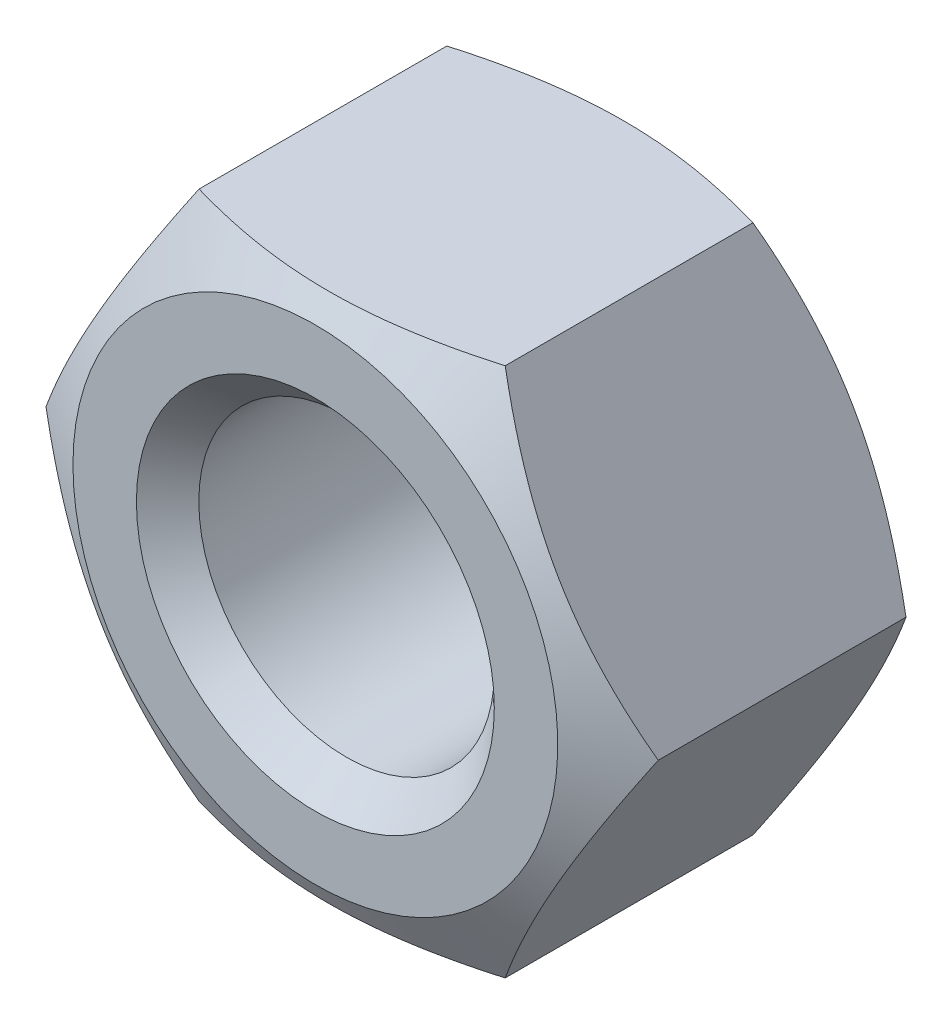
ISO-10303-21;
HEADER;
FILE_DESCRIPTION(('STEP AP214'),'2;1');
FILE_NAME('part.step','',(''),(''),'','','');
FILE_SCHEMA(('AUTOMOTIVE_DESIGN { 1 0 10303 214 1 1 1 1 }'));
ENDSEC;
DATA;
#1=APPLICATION_CONTEXT('core data for automotive mechanical design processes');
#2=APPLICATION_PROTOCOL_DEFINITION('international standard','automotive_design',2000,#1);
#3=PRODUCT_CONTEXT('',#1,'mechanical');
#4=PRODUCT('Part','Part','',(#3));
#5=PRODUCT_RELATED_PRODUCT_CATEGORY('part','',(#4));
#6=PRODUCT_DEFINITION_FORMATION('','',#4);
#7=PRODUCT_DEFINITION_CONTEXT('part definition',#1,'design');
#8=PRODUCT_DEFINITION('design','',#6,#7);
#9=PRODUCT_DEFINITION_SHAPE('','',#8);
#10=(LENGTH_UNIT() NAMED_UNIT(*) SI_UNIT(.MILLI.,.METRE.));
#11=(NAMED_UNIT(*) PLANE_ANGLE_UNIT() SI_UNIT($,.RADIAN.));
#12=(NAMED_UNIT(*) SI_UNIT($,.STERADIAN.) SOLID_ANGLE_UNIT());
#13=UNCERTAINTY_MEASURE_WITH_UNIT(LENGTH_MEASURE(1.E-05),#10,'distance_accuracy_value','');
#14=(GEOMETRIC_REPRESENTATION_CONTEXT(3) GLOBAL_UNCERTAINTY_ASSIGNED_CONTEXT((#13)) GLOBAL_UNIT_ASSIGNED_CONTEXT((#10,
#11,#12)) REPRESENTATION_CONTEXT('',''));
#15=CARTESIAN_POINT('',(0.,0.,0.));
#16=DIRECTION('',(0.,0.,1.));
#17=DIRECTION('',(1.,0.,0.));
#18=AXIS2_PLACEMENT_3D('',#15,#16,#17);
#19=CARTESIAN_POINT('',(-4.61880215351701,-8.,-9.3));
#20=DIRECTION('',(0.,-1.,0.));
#21=DIRECTION('',(0.,0.,-1.));
#22=AXIS2_PLACEMENT_3D('',#19,#20,#21);
#23=PLANE('',#22);
#24=DIRECTION('',(0.,0.,1.));
#25=VECTOR('',#24,1.);
#26=CARTESIAN_POINT('',(4.61880215351701,-8.,-9.3));
#27=LINE('',#26,#25);
#28=CARTESIAN_POINT('',(4.618802153517,-8.,-8.58546882018368));
#29=VERTEX_POINT('',#28);
#30=CARTESIAN_POINT('',(4.61880215351701,-8.,-1.11001611421122));
#31=VERTEX_POINT('',#30);
#32=EDGE_CURVE('E142',#29,#31,#27,.T.);
#33=ORIENTED_EDGE('',*,*,#32,.T.);
#34=CARTESIAN_POINT('',(-12.1949748492486,-8.,-4.19724118622931));
#35=CARTESIAN_POINT('',(-11.8441525038451,-8.,-4.02793268891842));
#36=CARTESIAN_POINT('',(-11.4924944780281,-8.,-3.86032413028313));
#37=CARTESIAN_POINT('',(-10.7870549229949,-8.,-3.52947959624148));
#38=CARTESIAN_POINT('',(-10.4332730330776,-8.,-3.36624439085434));
#39=CARTESIAN_POINT('',(-9.72119527642904,-8.,-3.04424732546881));
#40=CARTESIAN_POINT('',(-9.36288512784639,-8.,-2.88551693342629));
#41=CARTESIAN_POINT('',(-8.6432995701573,-8.,-2.574953375877));
#42=CARTESIAN_POINT('',(-8.28202431872118,-8.,-2.42311984639713));
#43=CARTESIAN_POINT('',(-7.55170487318987,-8.,-2.12648838512486));
#44=CARTESIAN_POINT('',(-7.18261915131932,-8.,-1.98179212335422));
#45=CARTESIAN_POINT('',(-6.44007589079319,-8.,-1.70386945908389));
#46=CARTESIAN_POINT('',(-6.0666178689625,-8.,-1.57064433809319));
#47=CARTESIAN_POINT('',(-5.31551676447197,-8.,-1.31928431629794));
#48=CARTESIAN_POINT('',(-4.9378847017788,-8.,-1.20111684863991));
#49=CARTESIAN_POINT('',(-4.17726851344058,-8.,-0.983743090850943));
#50=CARTESIAN_POINT('',(-3.79428613643383,-8.,-0.884530754330406));
#51=CARTESIAN_POINT('',(-3.02262181211731,-8.,-0.709920973952184));
#52=CARTESIAN_POINT('',(-2.63393771225764,-8.,-0.634532779779429));
#53=CARTESIAN_POINT('',(-2.04753859900277,-8.,-0.543124585972716));
#54=CARTESIAN_POINT('',(-1.8514859408059,-8.,-0.516265583396867));
#55=CARTESIAN_POINT('',(-1.45847995672493,-8.,-0.470301524605603));
#56=CARTESIAN_POINT('',(-1.26152671768549,-8.,-0.451195736041205));
#57=CARTESIAN_POINT('',(-0.868204305547407,-8.,-0.421249766233311));
#58=CARTESIAN_POINT('',(-0.671838949148873,-8.,-0.410359651726772));
#59=CARTESIAN_POINT('',(-0.278823944329975,-8.,-0.39690166509556));
#60=CARTESIAN_POINT('',(-0.0821743001878422,-8.,-0.394333669009646));
#61=CARTESIAN_POINT('',(0.311002357947693,-8.,-0.397580881899422));
#62=CARTESIAN_POINT('',(0.50752939079069,-8.,-0.403393786882911));
#63=CARTESIAN_POINT('',(0.900169309914778,-8.,-0.423259858206472));
#64=CARTESIAN_POINT('',(1.09628217308338,-8.,-0.437313472824583));
#65=CARTESIAN_POINT('',(1.57322634258838,-8.,-0.481221762837537));
#66=CARTESIAN_POINT('',(1.85367662645004,-8.,-0.515295721906791));
#67=CARTESIAN_POINT('',(2.41234314578804,-8.,-0.598385815642348));
#68=CARTESIAN_POINT('',(2.690559036092,-8.,-0.647404215050205));
#69=CARTESIAN_POINT('',(3.52235877714175,-8.,-0.814413300270185));
#70=CARTESIAN_POINT('',(4.07200316956031,-8.,-0.952244696212976));
#71=CARTESIAN_POINT('',(4.89407143348197,-8.,-1.18944101491719));
#72=CARTESIAN_POINT('',(5.17080192256967,-8.,-1.27472329993464));
#73=CARTESIAN_POINT('',(5.72158954521634,-8.,-1.45367681640488));
#74=CARTESIAN_POINT('',(5.99564643756773,-8.,-1.54734879714129));
#75=CARTESIAN_POINT('',(6.53971765413399,-8.,-1.7410831972039));
#76=CARTESIAN_POINT('',(6.80974608565716,-8.,-1.8411063985716));
#77=CARTESIAN_POINT('',(7.34751308876101,-8.,-2.04687153439181));
#78=CARTESIAN_POINT('',(7.61525241587318,-8.,-2.15261149038612));
#79=CARTESIAN_POINT('',(7.8820292455801,-8.,-2.2606729368487));
#80=B_SPLINE_CURVE_WITH_KNOTS('',3,(#34,#35,#36,#37,#38,#39,#40,#41,#42,#43,#44,#45,#46,#47,#48,
#49,#50,#51,#52,#53,#54,#55,#56,#57,#58,#59,#60,#61,#62,#63,#64,#65,#66,#67,#68,#69,#70,#71,#72,
#73,#74,#75,#76,#77,#78,#79),.UNSPECIFIED.,.F.,.F.,(4,2,2,2,2,2,2,2,2,2,2,2,2,2,2,2,2,2,2,2,2,2,
4),(0.,1.16863703281298,2.33747849380213,3.51310498437554,4.68866936050934,5.87782866135943,
7.0671206383311,8.25379509233117,9.44009038147788,10.62684568362,11.2203681854234,
11.8138346115359,12.4036643426842,12.9934852880453,13.5831441167368,14.1728350246593,
15.0198905398413,15.8670744851381,17.5647199147032,18.433374582602,19.3021069075453,
20.165916700221,21.0294294352115),.UNSPECIFIED.);
#81=CARTESIAN_POINT('',(-4.618802153517,-8.00000000000001,-1.11001611421122));
#82=VERTEX_POINT('',#81);
#83=EDGE_CURVE('E50',#31,#82,#80,.F.);
#84=ORIENTED_EDGE('',*,*,#83,.T.);
#85=DIRECTION('',(0.,0.,1.));
#86=VECTOR('',#85,1.);
#87=CARTESIAN_POINT('',(-4.61880215351701,-8.,-9.3));
#88=LINE('',#87,#86);
#89=CARTESIAN_POINT('',(-4.618802153517,-8.,-8.58546882018368));
#90=VERTEX_POINT('',#89);
#91=EDGE_CURVE('E123',#90,#82,#88,.T.);
#92=ORIENTED_EDGE('',*,*,#91,.F.);
#93=CARTESIAN_POINT('',(-12.2497439799177,-8.,-5.47178635751885));
#94=CARTESIAN_POINT('',(-11.8984987351192,-8.,-5.64152745781741));
#95=CARTESIAN_POINT('',(-11.5464230390782,-8.,-5.80958119206085));
#96=CARTESIAN_POINT('',(-10.8401616983867,-8.,-6.14134970673033));
#97=CARTESIAN_POINT('',(-10.4859757012545,-8.,-6.30506373591479));
#98=CARTESIAN_POINT('',(-9.77313142803809,-8.,-6.62805107323012));
#99=CARTESIAN_POINT('',(-9.41445915782843,-8.,-6.78729360758338));
#100=CARTESIAN_POINT('',(-8.69416671490282,-8.,-7.09893883145));
#101=CARTESIAN_POINT('',(-8.33254669701134,-8.,-7.25134187749306));
#102=CARTESIAN_POINT('',(-7.60129405984853,-8.,-7.54929869059785));
#103=CARTESIAN_POINT('',(-7.23161757485956,-8.,-7.69474539925));
#104=CARTESIAN_POINT('',(-6.48790521752625,-8.,-7.97424757040319));
#105=CARTESIAN_POINT('',(-6.11386886541891,-8.,-8.1083017655467));
#106=CARTESIAN_POINT('',(-5.36160531585211,-8.,-8.36141638272023));
#107=CARTESIAN_POINT('',(-4.98338896232049,-8.,-8.48050868146435));
#108=CARTESIAN_POINT('',(-4.22159300341406,-8.,-8.69983373573668));
#109=CARTESIAN_POINT('',(-3.83801513546604,-8.,-8.80007245532316));
#110=CARTESIAN_POINT('',(-3.06517005833207,-8.,-8.97681673496987));
#111=CARTESIAN_POINT('',(-2.67590136311895,-8.,-9.05331597577213));
#112=CARTESIAN_POINT('',(-2.0885729036225,-8.,-9.14642984148509));
#113=CARTESIAN_POINT('',(-1.89220175174277,-8.,-9.17386398482566));
#114=CARTESIAN_POINT('',(-1.49853877384914,-8.,-9.22098081548842));
#115=CARTESIAN_POINT('',(-1.30124704094028,-8.,-9.24066427020763));
#116=CARTESIAN_POINT('',(-0.907261125171467,-8.,-9.27175001536059));
#117=CARTESIAN_POINT('',(-0.710571016085377,-8.,-9.28320372918925));
#118=CARTESIAN_POINT('',(-0.316882268583067,-8.,-9.29776943665632));
#119=CARTESIAN_POINT('',(-0.11988363420673,-8.,-9.30088153862247));
#120=CARTESIAN_POINT('',(0.274012171056988,-8.,-9.29868986812036));
#121=CARTESIAN_POINT('',(0.470909354903373,-8.,-9.29338845754377));
#122=CARTESIAN_POINT('',(0.864308658379612,-8.,-9.27450159390205));
#123=CARTESIAN_POINT('',(1.06081075778877,-8.,-9.26091572714249));
#124=CARTESIAN_POINT('',(1.53707134445824,-8.,-9.21823147688152));
#125=CARTESIAN_POINT('',(1.81646391313848,-8.,-9.18498228456822));
#126=CARTESIAN_POINT('',(2.37310809107458,-8.,-9.10358169500833));
#127=CARTESIAN_POINT('',(2.6503590947618,-8.,-9.05542623022555));
#128=CARTESIAN_POINT('',(3.20249141370953,-8.,-8.94592101606853));
#129=CARTESIAN_POINT('',(3.47737023104613,-8.,-8.88455879141516));
#130=CARTESIAN_POINT('',(4.02429975324255,-8.,-8.75051229166833));
#131=CARTESIAN_POINT('',(4.29635072195133,-8.,-8.67782908316642));
#132=CARTESIAN_POINT('',(4.84432510211618,-8.,-8.52097954855783));
#133=CARTESIAN_POINT('',(5.12017997476417,-8.,-8.43657541783993));
#134=CARTESIAN_POINT('',(5.66897392708338,-8.,-8.25942754035761));
#135=CARTESIAN_POINT('',(5.94191487461255,-8.,-8.16668954576064));
#136=CARTESIAN_POINT('',(6.48378576423065,-8.,-7.97478953482265));
#137=CARTESIAN_POINT('',(6.75272963565239,-8.,-7.87566661531194));
#138=CARTESIAN_POINT('',(7.28853074702756,-8.,-7.67160282538498));
#139=CARTESIAN_POINT('',(7.55538709319948,-8.,-7.56665960355147));
#140=CARTESIAN_POINT('',(7.82127397973363,-8.,-7.45938198691646));
#141=B_SPLINE_CURVE_WITH_KNOTS('',3,(#93,#94,#95,#96,#97,#98,#99,#100,#101,#102,#103,#104,#105,
#106,#107,#108,#109,#110,#111,#112,#113,#114,#115,#116,#117,#118,#119,#120,#121,#122,#123,#124,
#125,#126,#127,#128,#129,#130,#131,#132,#133,#134,#135,#136,#137,#138,#139,#140),.UNSPECIFIED.,
.F.,.F.,(4,2,2,2,2,2,2,2,2,2,2,2,2,2,2,2,2,2,2,2,2,2,2,4),(0.,1.17034358506454,2.3408884611985,
3.51813189291972,4.69531388569646,5.88694801994962,7.07871454421366,8.26789729395168,
9.45670322782925,10.6458253413567,11.2405311012284,11.8351779643656,12.4260760875167,
13.0169665369751,13.6076911374643,14.1984452389235,15.0420672118768,15.8859195906795,
16.7305726096943,17.5751460989191,18.4404219096463,19.305105014024,20.1649211009825,
21.0250871227257),.UNSPECIFIED.);
#142=CARTESIAN_POINT('',(0.,-8.,-9.3));
#143=VERTEX_POINT('',#142);
#144=EDGE_CURVE('E227',#90,#143,#141,.T.);
#145=ORIENTED_EDGE('',*,*,#144,.T.);
#146=EDGE_CURVE('E222',#143,#29,#141,.T.);
#147=ORIENTED_EDGE('',*,*,#146,.T.);
#148=EDGE_LOOP('',(#33,#84,#92,#145,#147));
#149=FACE_BOUND('',#148,.T.);
#150=ADVANCED_FACE('F35',(#149),#23,.T.);
#151=CARTESIAN_POINT('',(-9.23760430703401,0.,-9.3));
#152=DIRECTION('',(-0.866025403784439,-0.5,0.));
#153=DIRECTION('',(0.5,-0.866025403784439,0.));
#154=AXIS2_PLACEMENT_3D('',#151,#152,#153);
#155=PLANE('',#154);
#156=ORIENTED_EDGE('',*,*,#91,.T.);
#157=CARTESIAN_POINT('',(-4.61868668346317,-8.0002,-1.11008278212786));
#158=CARTESIAN_POINT('',(-4.72021302617289,-7.8243512161201,-1.05147564844219));
#159=CARTESIAN_POINT('',(-4.82211789504564,-7.64784680569386,-0.99552833544218));
#160=CARTESIAN_POINT('',(-5.02675523421805,-7.29340453712154,-0.889685939419556));
#161=CARTESIAN_POINT('',(-5.12948804149869,-7.11546609530729,-0.839793468825956));
#162=CARTESIAN_POINT('',(-5.43933133858026,-6.57880176237735,-0.700177731601756));
#163=CARTESIAN_POINT('',(-5.64766491807818,-6.21795741776427,-0.620766105373259));
#164=CARTESIAN_POINT('',(-5.95943209350317,-5.67796082979595,-0.527646580689379));
#165=CARTESIAN_POINT('',(-6.06193429416807,-5.50042181035671,-0.501119515424015));
#166=CARTESIAN_POINT('',(-6.26740224104455,-5.1445408870398,-0.456638109253766));
#167=CARTESIAN_POINT('',(-6.37036794548792,-4.96619905550676,-0.438683010909471));
#168=CARTESIAN_POINT('',(-6.57647664551585,-4.6092083151764,-0.411800582886755));
#169=CARTESIAN_POINT('',(-6.67961930623067,-4.4305599863905,-0.402863007941123));
#170=CARTESIAN_POINT('',(-6.88599991003618,-4.07309829490261,-0.39420723836002));
#171=CARTESIAN_POINT('',(-6.98923785008464,-3.89428493746993,-0.39448875889774));
#172=CARTESIAN_POINT('',(-7.18224506616975,-3.55998663298309,-0.403629959663666));
#173=CARTESIAN_POINT('',(-7.27202796205376,-3.40447809566133,-0.41137453876226));
#174=CARTESIAN_POINT('',(-7.45138347289924,-3.09382523825949,-0.433686069248319));
#175=CARTESIAN_POINT('',(-7.5409560732765,-2.93868094344,-0.448253480533037));
#176=CARTESIAN_POINT('',(-7.80932710333148,-2.47384868410518,-0.501845624922425));
#177=CARTESIAN_POINT('',(-7.98765049311728,-2.16498351281828,-0.550753576064033));
#178=CARTESIAN_POINT('',(-8.34618890253624,-1.5439767712397,-0.673024337629203));
#179=CARTESIAN_POINT('',(-8.52635816315521,-1.23191445788552,-0.746905454770888));
#180=CARTESIAN_POINT('',(-8.88400987687704,-0.612443518305239,-0.914585075649859));
#181=CARTESIAN_POINT('',(-9.06149691008277,-0.305026959108247,-1.00834419524934));
#182=CARTESIAN_POINT('',(-9.23771977708785,0.000200000000002295,-1.11008278212786));
#183=B_SPLINE_CURVE_WITH_KNOTS('',3,(#157,#158,#159,#160,#161,#162,#163,#164,#165,#166,#167,
#168,#169,#170,#171,#172,#173,#174,#175,#176,#177,#178,#179,#180,#181,#182),.UNSPECIFIED.,.F.,
.F.,(4,2,2,2,2,2,2,2,2,2,2,2,4),(0.,0.633973543721349,1.26821965714356,2.53934712434766,
3.15934343977049,3.77928496069784,4.39852133866766,5.01773858515595,5.55680239410248,
6.09590254421147,7.17487077411835,8.27776850154292,9.37850115249054),.UNSPECIFIED.);
#184=CARTESIAN_POINT('',(-9.23760430703402,0.,-1.11001611421122));
#185=VERTEX_POINT('',#184);
#186=EDGE_CURVE('E107',#82,#185,#183,.T.);
#187=ORIENTED_EDGE('',*,*,#186,.T.);
#188=DIRECTION('',(0.,0.,1.));
#189=VECTOR('',#188,1.);
#190=CARTESIAN_POINT('',(-9.23760430703401,0.,-9.3));
#191=LINE('',#190,#189);
#192=CARTESIAN_POINT('',(-9.23760430703401,0.,-8.58546882018368));
#193=VERTEX_POINT('',#192);
#194=EDGE_CURVE('E120',#193,#185,#191,.T.);
#195=ORIENTED_EDGE('',*,*,#194,.F.);
#196=CARTESIAN_POINT('',(-9.23771977708785,0.000200000000001784,-8.58540215226703));
#197=CARTESIAN_POINT('',(-9.13619343437813,-0.175648783879895,-8.64400928595271));
#198=CARTESIAN_POINT('',(-9.03428856550538,-0.352153194306133,-8.69995659895271));
#199=CARTESIAN_POINT('',(-8.82965122633297,-0.706595462878457,-8.80579899497534));
#200=CARTESIAN_POINT('',(-8.72691841905232,-0.884533904692709,-8.85569146556894));
#201=CARTESIAN_POINT('',(-8.41707512197076,-1.42119823762264,-8.99530720279314));
#202=CARTESIAN_POINT('',(-8.20874154247284,-1.78204258223572,-9.07471882902163));
#203=CARTESIAN_POINT('',(-7.89697436704785,-2.32203917020405,-9.16783835370551));
#204=CARTESIAN_POINT('',(-7.79447216638295,-2.49957818964328,-9.19436541897088));
#205=CARTESIAN_POINT('',(-7.58900421950647,-2.8554591129602,-9.23884682514113));
#206=CARTESIAN_POINT('',(-7.4860385150631,-3.03380094449324,-9.25680192348542));
#207=CARTESIAN_POINT('',(-7.27992981503517,-3.39079168482359,-9.28368435150814));
#208=CARTESIAN_POINT('',(-7.17678715432035,-3.5694400136095,-9.29262192645377));
#209=CARTESIAN_POINT('',(-6.97040655051484,-3.92690170509738,-9.30127769603487));
#210=CARTESIAN_POINT('',(-6.86716861046638,-4.10571506253006,-9.30099617549715));
#211=CARTESIAN_POINT('',(-6.67416139438127,-4.4400133670169,-9.29185497473123));
#212=CARTESIAN_POINT('',(-6.58437849849726,-4.59552190433867,-9.28411039563264));
#213=CARTESIAN_POINT('',(-6.40502298765178,-4.90617476174051,-9.26179886514658));
#214=CARTESIAN_POINT('',(-6.31545038727451,-5.06131905656,-9.24723145386186));
#215=CARTESIAN_POINT('',(-6.04707935721954,-5.52615131589481,-9.19363930947247));
#216=CARTESIAN_POINT('',(-5.86875596743374,-5.83501648718172,-9.14473135833086));
#217=CARTESIAN_POINT('',(-5.51021755801478,-6.4560232287603,-9.02246059676569));
#218=CARTESIAN_POINT('',(-5.3300482973958,-6.76808554211447,-8.94857947962401));
#219=CARTESIAN_POINT('',(-4.97239658367398,-7.38755648169476,-8.78089985874504));
#220=CARTESIAN_POINT('',(-4.79490955046825,-7.69497304089175,-8.68714073914555));
#221=CARTESIAN_POINT('',(-4.61868668346317,-8.0002,-8.58540215226703));
#222=B_SPLINE_CURVE_WITH_KNOTS('',3,(#196,#197,#198,#199,#200,#201,#202,#203,#204,#205,#206,
#207,#208,#209,#210,#211,#212,#213,#214,#215,#216,#217,#218,#219,#220,#221),.UNSPECIFIED.,.F.,
.F.,(4,2,2,2,2,2,2,2,2,2,2,2,4),(0.,0.633973543721349,1.26821965714356,2.53934712434766,
3.15934343977049,3.77928496069784,4.39852133866765,5.01773858515595,5.55680239410248,
6.09590254421147,7.17487077411834,8.27776850154292,9.37850115249054),.UNSPECIFIED.);
#223=CARTESIAN_POINT('',(-6.92820323027551,-4.,-9.3));
#224=VERTEX_POINT('',#223);
#225=EDGE_CURVE('E167',#193,#224,#222,.T.);
#226=ORIENTED_EDGE('',*,*,#225,.T.);
#227=EDGE_CURVE('E168',#224,#90,#222,.T.);
#228=ORIENTED_EDGE('',*,*,#227,.T.);
#229=EDGE_LOOP('',(#156,#187,#195,#226,#228));
#230=FACE_BOUND('',#229,.T.);
#231=ADVANCED_FACE('F118',(#230),#155,.T.);
#232=CARTESIAN_POINT('',(-4.61880215351701,8.,-9.3));
#233=DIRECTION('',(-0.866025403784439,0.5,0.));
#234=DIRECTION('',(-0.5,-0.866025403784439,0.));
#235=AXIS2_PLACEMENT_3D('',#232,#233,#234);
#236=PLANE('',#235);
#237=ORIENTED_EDGE('',*,*,#194,.T.);
#238=CARTESIAN_POINT('',(-9.23771977708785,-0.000199999999998216,-1.11008278212786));
#239=CARTESIAN_POINT('',(-9.13619343437812,0.175648783879898,-1.05147564844219));
#240=CARTESIAN_POINT('',(-9.03428856550538,0.352153194306137,-0.995528335442182));
#241=CARTESIAN_POINT('',(-8.82965122633296,0.706595462878461,-0.889685939419558));
#242=CARTESIAN_POINT('',(-8.72691841905232,0.884533904692714,-0.839793468825958));
#243=CARTESIAN_POINT('',(-8.41707512197076,1.42119823762265,-0.700177731601756));
#244=CARTESIAN_POINT('',(-8.20874154247284,1.78204258223572,-0.620766105373259));
#245=CARTESIAN_POINT('',(-7.89697436704785,2.32203917020405,-0.52764658068938));
#246=CARTESIAN_POINT('',(-7.79447216638294,2.49957818964329,-0.501119515424016));
#247=CARTESIAN_POINT('',(-7.58900421950647,2.8554591129602,-0.456638109253767));
#248=CARTESIAN_POINT('',(-7.4860385150631,3.03380094449324,-0.438683010909471));
#249=CARTESIAN_POINT('',(-7.27992981503517,3.3907916848236,-0.411800582886757));
#250=CARTESIAN_POINT('',(-7.17678715432035,3.5694400136095,-0.402863007941125));
#251=CARTESIAN_POINT('',(-6.97040655051484,3.92690170509739,-0.394207238360022));
#252=CARTESIAN_POINT('',(-6.86716861046638,4.10571506253007,-0.394488758897741));
#253=CARTESIAN_POINT('',(-6.67416139438127,4.44001336701691,-0.403629959663667));
#254=CARTESIAN_POINT('',(-6.58437849849726,4.59552190433867,-0.411374538762261));
#255=CARTESIAN_POINT('',(-6.40502298765178,4.90617476174051,-0.43368606924832));
#256=CARTESIAN_POINT('',(-6.31545038727451,5.06131905656,-0.448253480533039));
#257=CARTESIAN_POINT('',(-6.04707935721953,5.52615131589482,-0.501845624922427));
#258=CARTESIAN_POINT('',(-5.86875596743374,5.83501648718172,-0.550753576064035));
#259=CARTESIAN_POINT('',(-5.51021755801478,6.4560232287603,-0.673024337629205));
#260=CARTESIAN_POINT('',(-5.3300482973958,6.76808554211448,-0.746905454770891));
#261=CARTESIAN_POINT('',(-4.97239658367398,7.38755648169476,-0.914585075649863));
#262=CARTESIAN_POINT('',(-4.79490955046825,7.69497304089176,-1.00834419524935));
#263=CARTESIAN_POINT('',(-4.61868668346317,8.00020000000001,-1.11008278212787));
#264=B_SPLINE_CURVE_WITH_KNOTS('',3,(#238,#239,#240,#241,#242,#243,#244,#245,#246,#247,#248,
#249,#250,#251,#252,#253,#254,#255,#256,#257,#258,#259,#260,#261,#262,#263),.UNSPECIFIED.,.F.,
.F.,(4,2,2,2,2,2,2,2,2,2,2,2,4),(0.,0.633973543721351,1.26821965714356,2.53934712434766,
3.15934343977049,3.77928496069784,4.39852133866766,5.01773858515595,5.55680239410249,
6.09590254421148,7.17487077411835,8.27776850154293,9.37850115249055),.UNSPECIFIED.);
#265=CARTESIAN_POINT('',(-4.61880215351701,8.00000000000001,-1.11001611421122));
#266=VERTEX_POINT('',#265);
#267=EDGE_CURVE('E104',#185,#266,#264,.T.);
#268=ORIENTED_EDGE('',*,*,#267,.T.);
#269=DIRECTION('',(0.,0.,1.));
#270=VECTOR('',#269,1.);
#271=CARTESIAN_POINT('',(-4.61880215351701,8.,-9.3));
#272=LINE('',#271,#270);
#273=CARTESIAN_POINT('',(-4.618802153517,8.,-8.58546882018368));
#274=VERTEX_POINT('',#273);
#275=EDGE_CURVE('E129',#274,#266,#272,.T.);
#276=ORIENTED_EDGE('',*,*,#275,.F.);
#277=CARTESIAN_POINT('',(-4.61868668346317,8.0002,-8.58540215226703));
#278=CARTESIAN_POINT('',(-4.72021302617289,7.82435121612011,-8.64400928595271));
#279=CARTESIAN_POINT('',(-4.82211789504564,7.64784680569387,-8.69995659895271));
#280=CARTESIAN_POINT('',(-5.02675523421805,7.29340453712154,-8.80579899497534));
#281=CARTESIAN_POINT('',(-5.12948804149869,7.11546609530729,-8.85569146556894));
#282=CARTESIAN_POINT('',(-5.43933133858026,6.57880176237736,-8.99530720279314));
#283=CARTESIAN_POINT('',(-5.64766491807818,6.21795741776428,-9.07471882902163));
#284=CARTESIAN_POINT('',(-5.95943209350317,5.67796082979595,-9.16783835370551));
#285=CARTESIAN_POINT('',(-6.06193429416807,5.50042181035672,-9.19436541897088));
#286=CARTESIAN_POINT('',(-6.26740224104455,5.1445408870398,-9.23884682514113));
#287=CARTESIAN_POINT('',(-6.37036794548792,4.96619905550676,-9.25680192348542));
#288=CARTESIAN_POINT('',(-6.57647664551585,4.60920831517641,-9.28368435150814));
#289=CARTESIAN_POINT('',(-6.67961930623067,4.4305599863905,-9.29262192645377));
#290=CARTESIAN_POINT('',(-6.88599991003618,4.07309829490262,-9.30127769603487));
#291=CARTESIAN_POINT('',(-6.98923785008464,3.89428493746994,-9.30099617549715));
#292=CARTESIAN_POINT('',(-7.18224506616975,3.5599866329831,-9.29185497473123));
#293=CARTESIAN_POINT('',(-7.27202796205376,3.40447809566133,-9.28411039563263));
#294=CARTESIAN_POINT('',(-7.45138347289924,3.09382523825949,-9.26179886514658));
#295=CARTESIAN_POINT('',(-7.5409560732765,2.93868094344001,-9.24723145386186));
#296=CARTESIAN_POINT('',(-7.80932710333148,2.47384868410519,-9.19363930947247));
#297=CARTESIAN_POINT('',(-7.98765049311728,2.16498351281828,-9.14473135833086));
#298=CARTESIAN_POINT('',(-8.34618890253624,1.5439767712397,-9.02246059676569));
#299=CARTESIAN_POINT('',(-8.52635816315521,1.23191445788553,-8.94857947962401));
#300=CARTESIAN_POINT('',(-8.88400987687704,0.612443518305244,-8.78089985874504));
#301=CARTESIAN_POINT('',(-9.06149691008277,0.305026959108252,-8.68714073914555));
#302=CARTESIAN_POINT('',(-9.23771977708785,-0.000199999999998172,-8.58540215226703));
#303=B_SPLINE_CURVE_WITH_KNOTS('',3,(#277,#278,#279,#280,#281,#282,#283,#284,#285,#286,#287,
#288,#289,#290,#291,#292,#293,#294,#295,#296,#297,#298,#299,#300,#301,#302),.UNSPECIFIED.,.F.,
.F.,(4,2,2,2,2,2,2,2,2,2,2,2,4),(0.,0.633973543721351,1.26821965714356,2.53934712434766,
3.15934343977049,3.77928496069784,4.39852133866766,5.01773858515595,5.55680239410248,
6.09590254421147,7.17487077411834,8.27776850154292,9.37850115249054),.UNSPECIFIED.);
#304=CARTESIAN_POINT('',(-6.92820323027551,4.,-9.3));
#305=VERTEX_POINT('',#304);
#306=EDGE_CURVE('E145',#274,#305,#303,.T.);
#307=ORIENTED_EDGE('',*,*,#306,.T.);
#308=EDGE_CURVE('E128',#305,#193,#303,.T.);
#309=ORIENTED_EDGE('',*,*,#308,.T.);
#310=EDGE_LOOP('',(#237,#268,#276,#307,#309));
#311=FACE_BOUND('',#310,.T.);
#312=ADVANCED_FACE('F126',(#311),#236,.T.);
#313=CARTESIAN_POINT('',(4.61880215351701,8.,-9.3));
#314=DIRECTION('',(0.,1.,0.));
#315=DIRECTION('',(-1.,0.,0.));
#316=AXIS2_PLACEMENT_3D('',#313,#314,#315);
#317=PLANE('',#316);
#318=ORIENTED_EDGE('',*,*,#275,.T.);
#319=CARTESIAN_POINT('',(-12.1949748492633,8.00000000000001,-4.19724118623644));
#320=CARTESIAN_POINT('',(-11.8441525038593,8.00000000000001,-4.02793268892525));
#321=CARTESIAN_POINT('',(-11.4924944780419,8.00000000000001,-3.86032413028965));
#322=CARTESIAN_POINT('',(-10.7870549230076,8.00000000000001,-3.52947959624739));
#323=CARTESIAN_POINT('',(-10.4332730330898,8.00000000000001,-3.36624439085995));
#324=CARTESIAN_POINT('',(-9.72119527644025,8.00000000000001,-3.04424732547381));
#325=CARTESIAN_POINT('',(-9.36288512785708,8.,-2.88551693343098));
#326=CARTESIAN_POINT('',(-8.64329957016696,8.,-2.5749533758811));
#327=CARTESIAN_POINT('',(-8.28202431873031,8.,-2.42311984640092));
#328=CARTESIAN_POINT('',(-7.55170487319796,8.,-2.12648838512806));
#329=CARTESIAN_POINT('',(-7.18261915132687,8.,-1.98179212335714));
#330=CARTESIAN_POINT('',(-6.44007589079966,8.,-1.70386945908623));
#331=CARTESIAN_POINT('',(-6.06661786896844,8.,-1.57064433809526));
#332=CARTESIAN_POINT('',(-5.31551676447682,8.,-1.31928431629948));
#333=CARTESIAN_POINT('',(-4.9378847017831,8.,-1.20111684864121));
#334=CARTESIAN_POINT('',(-4.17726851344375,8.,-0.983743090851787));
#335=CARTESIAN_POINT('',(-3.79428613643644,8.,-0.884530754331043));
#336=CARTESIAN_POINT('',(-3.02262181211847,8.,-0.709920973952406));
#337=CARTESIAN_POINT('',(-2.6339377122579,8.,-0.634532779779459));
#338=CARTESIAN_POINT('',(-2.04753859900169,8.,-0.543124585972559));
#339=CARTESIAN_POINT('',(-1.85148594080437,8.,-0.516265583396665));
#340=CARTESIAN_POINT('',(-1.4584799567225,8.,-0.470301524605348));
#341=CARTESIAN_POINT('',(-1.26152671768259,8.,-0.451195736040943));
#342=CARTESIAN_POINT('',(-0.868204305543611,8.,-0.421249766233073));
#343=CARTESIAN_POINT('',(-0.671838949144625,8.,-0.410359651726564));
#344=CARTESIAN_POINT('',(-0.278823944324826,8.,-0.396901665095454));
#345=CARTESIAN_POINT('',(-0.0821743001822435,8.,-0.394333669009612));
#346=CARTESIAN_POINT('',(0.311002357954187,8.,-0.397580881899566));
#347=CARTESIAN_POINT('',(0.50752939079763,8.,-0.403393786883162));
#348=CARTESIAN_POINT('',(0.900169309922605,8.,-0.423259858206975));
#349=CARTESIAN_POINT('',(1.09628217309165,8.,-0.437313472825229));
#350=CARTESIAN_POINT('',(1.57322634259735,8.,-0.481221762838537));
#351=CARTESIAN_POINT('',(1.85367662645928,8.,-0.515295721907996));
#352=CARTESIAN_POINT('',(2.41234314579779,8.,-0.598385815643975));
#353=CARTESIAN_POINT('',(2.690559036102,8.,-0.647404215052047));
#354=CARTESIAN_POINT('',(3.52235877715249,8.,-0.814413300272683));
#355=CARTESIAN_POINT('',(4.07200316957153,8.,-0.952244696215917));
#356=CARTESIAN_POINT('',(4.8940714334939,8.,-1.18944101492079));
#357=CARTESIAN_POINT('',(5.17080192258184,8.,-1.27472329993846));
#358=CARTESIAN_POINT('',(5.72158954522899,8.,-1.45367681640913));
#359=CARTESIAN_POINT('',(5.99564643758062,8.,-1.54734879714576));
#360=CARTESIAN_POINT('',(6.53971765414735,8.,-1.74108319720879));
#361=CARTESIAN_POINT('',(6.80974608567076,8.,-1.84110639857669));
#362=CARTESIAN_POINT('',(7.34751308877508,8.,-2.0468715343973));
#363=CARTESIAN_POINT('',(7.61525241588748,8.,-2.15261149039181));
#364=CARTESIAN_POINT('',(7.88202924559464,8.,-2.2606729368546));
#365=B_SPLINE_CURVE_WITH_KNOTS('',3,(#319,#320,#321,#322,#323,#324,#325,#326,#327,#328,#329,
#330,#331,#332,#333,#334,#335,#336,#337,#338,#339,#340,#341,#342,#343,#344,#345,#346,#347,#348,
#349,#350,#351,#352,#353,#354,#355,#356,#357,#358,#359,#360,#361,#362,#363,#364),.UNSPECIFIED.,
.F.,.F.,(4,2,2,2,2,2,2,2,2,2,2,2,2,2,2,2,2,2,2,2,2,2,4),(0.,1.16863703281475,2.33747849380566,
3.51310498438086,4.68866936051644,5.87782866136833,7.06712063834181,8.25379509234369,
9.4400903814922,10.6268456836371,11.2203681854418,11.8138346115557,12.4036643427053,
12.9934852880678,13.5831441167606,14.1728350246845,15.0198905398673,15.867074485165,
17.5647199147317,18.4333745826315,19.3021069075756,20.1659167002522,21.0294294352436),.UNSPECIFIED.);
#366=CARTESIAN_POINT('',(4.618802153517,8.00000000000001,-1.11001611421122));
#367=VERTEX_POINT('',#366);
#368=EDGE_CURVE('E109',#266,#367,#365,.T.);
#369=ORIENTED_EDGE('',*,*,#368,.T.);
#370=DIRECTION('',(0.,0.,1.));
#371=VECTOR('',#370,1.);
#372=CARTESIAN_POINT('',(4.61880215351701,8.,-9.3));
#373=LINE('',#372,#371);
#374=CARTESIAN_POINT('',(4.61880215351701,8.,-8.58546882018368));
#375=VERTEX_POINT('',#374);
#376=EDGE_CURVE('E133',#375,#367,#373,.T.);
#377=ORIENTED_EDGE('',*,*,#376,.F.);
#378=CARTESIAN_POINT('',(-12.2497439799179,8.00000000000001,-5.47178635751874));
#379=CARTESIAN_POINT('',(-11.8984987351194,8.00000000000001,-5.6415274578173));
#380=CARTESIAN_POINT('',(-11.5464230390785,8.00000000000001,-5.80958119206073));
#381=CARTESIAN_POINT('',(-10.840161698387,8.00000000000001,-6.14134970673022));
#382=CARTESIAN_POINT('',(-10.4859757012547,8.00000000000001,-6.30506373591468));
#383=CARTESIAN_POINT('',(-9.77313142803832,8.00000000000001,-6.62805107323002));
#384=CARTESIAN_POINT('',(-9.41445915782866,8.,-6.78729360758327));
#385=CARTESIAN_POINT('',(-8.69416671490305,8.,-7.0989388314499));
#386=CARTESIAN_POINT('',(-8.33254669701156,8.,-7.25134187749297));
#387=CARTESIAN_POINT('',(-7.60129405984875,8.,-7.54929869059776));
#388=CARTESIAN_POINT('',(-7.23161757485978,8.,-7.69474539924991));
#389=CARTESIAN_POINT('',(-6.48790521752647,8.,-7.97424757040311));
#390=CARTESIAN_POINT('',(-6.11386886541912,8.,-8.10830176554662));
#391=CARTESIAN_POINT('',(-5.36160531585232,8.,-8.36141638272016));
#392=CARTESIAN_POINT('',(-4.9833889623207,8.,-8.48050868146429));
#393=CARTESIAN_POINT('',(-4.22159300341427,8.,-8.69983373573663));
#394=CARTESIAN_POINT('',(-3.83801513546624,8.,-8.8000724553231));
#395=CARTESIAN_POINT('',(-3.06517005833226,8.,-8.97681673496982));
#396=CARTESIAN_POINT('',(-2.67590136311914,8.,-9.05331597577209));
#397=CARTESIAN_POINT('',(-2.0885729036227,8.,-9.14642984148506));
#398=CARTESIAN_POINT('',(-1.89220175174296,8.,-9.17386398482564));
#399=CARTESIAN_POINT('',(-1.49853877384933,8.,-9.2209808154884));
#400=CARTESIAN_POINT('',(-1.30124704094047,8.,-9.24066427020761));
#401=CARTESIAN_POINT('',(-0.907261125171655,8.,-9.27175001536057));
#402=CARTESIAN_POINT('',(-0.710571016085564,8.,-9.28320372918923));
#403=CARTESIAN_POINT('',(-0.316882268583253,8.,-9.29776943665632));
#404=CARTESIAN_POINT('',(-0.119883634206916,8.,-9.30088153862246));
#405=CARTESIAN_POINT('',(0.274012171056802,8.,-9.29868986812036));
#406=CARTESIAN_POINT('',(0.470909354903187,8.,-9.29338845754377));
#407=CARTESIAN_POINT('',(0.864308658379428,8.,-9.27450159390206));
#408=CARTESIAN_POINT('',(1.06081075778859,8.,-9.2609157271425));
#409=CARTESIAN_POINT('',(1.53707134445805,8.,-9.21823147688154));
#410=CARTESIAN_POINT('',(1.81646391313829,8.,-9.18498228456824));
#411=CARTESIAN_POINT('',(2.37310809107437,8.,-9.10358169500836));
#412=CARTESIAN_POINT('',(2.65035909476159,8.,-9.05542623022559));
#413=CARTESIAN_POINT('',(3.20249141370931,8.,-8.94592101606857));
#414=CARTESIAN_POINT('',(3.4773702310459,8.,-8.88455879141521));
#415=CARTESIAN_POINT('',(4.02429975324231,8.,-8.75051229166838));
#416=CARTESIAN_POINT('',(4.29635072195109,8.,-8.67782908316649));
#417=CARTESIAN_POINT('',(4.84432510211592,8.,-8.52097954855791));
#418=CARTESIAN_POINT('',(5.1201799747639,8.,-8.43657541784001));
#419=CARTESIAN_POINT('',(5.66897392708311,8.,-8.2594275403577));
#420=CARTESIAN_POINT('',(5.94191487461227,8.,-8.16668954576073));
#421=CARTESIAN_POINT('',(6.48378576423037,8.,-7.97478953482275));
#422=CARTESIAN_POINT('',(6.7527296356521,8.,-7.87566661531205));
#423=CARTESIAN_POINT('',(7.28853074702726,8.,-7.6716028253851));
#424=CARTESIAN_POINT('',(7.55538709319917,8.,-7.56665960355159));
#425=CARTESIAN_POINT('',(7.82127397973332,8.,-7.45938198691659));
#426=B_SPLINE_CURVE_WITH_KNOTS('',3,(#378,#379,#380,#381,#382,#383,#384,#385,#386,#387,#388,
#389,#390,#391,#392,#393,#394,#395,#396,#397,#398,#399,#400,#401,#402,#403,#404,#405,#406,#407,
#408,#409,#410,#411,#412,#413,#414,#415,#416,#417,#418,#419,#420,#421,#422,#423,#424,#425),
.UNSPECIFIED.,.F.,.F.,(4,2,2,2,2,2,2,2,2,2,2,2,2,2,2,2,2,2,2,2,2,2,2,4),(0.,1.17034358506455,
2.34088846119851,3.51813189291973,4.69531388569647,5.88694801994965,7.07871454421369,
8.26789729395173,9.45670322782931,10.6458253413568,11.2405311012285,11.8351779643657,
12.4260760875167,13.0169665369752,13.6076911374644,14.1984452389235,15.0420672118768,
15.8859195906795,16.7305726096943,17.5751460989191,18.4404219096463,19.3051050140239,
20.1649211009824,21.0250871227256),.UNSPECIFIED.);
#427=CARTESIAN_POINT('',(0.,8.,-9.3));
#428=VERTEX_POINT('',#427);
#429=EDGE_CURVE('E174',#375,#428,#426,.F.);
#430=ORIENTED_EDGE('',*,*,#429,.T.);
#431=EDGE_CURVE('E170',#428,#274,#426,.F.);
#432=ORIENTED_EDGE('',*,*,#431,.T.);
#433=EDGE_LOOP('',(#318,#369,#377,#430,#432));
#434=FACE_BOUND('',#433,.T.);
#435=ADVANCED_FACE('F272',(#434),#317,.T.);
#436=CARTESIAN_POINT('',(9.23760430703402,0.,-9.3));
#437=DIRECTION('',(0.866025403784438,0.5,0.));
#438=DIRECTION('',(-0.5,0.866025403784438,0.));
#439=AXIS2_PLACEMENT_3D('',#436,#437,#438);
#440=PLANE('',#439);
#441=ORIENTED_EDGE('',*,*,#376,.T.);
#442=CARTESIAN_POINT('',(4.61868668346317,8.0002,-1.11008278212787));
#443=CARTESIAN_POINT('',(4.72021302617289,7.82435121612011,-1.05147564844219));
#444=CARTESIAN_POINT('',(4.82211789504564,7.64784680569387,-0.995528335442183));
#445=CARTESIAN_POINT('',(5.02675523421805,7.29340453712154,-0.889685939419559));
#446=CARTESIAN_POINT('',(5.12948804149869,7.11546609530729,-0.839793468825959));
#447=CARTESIAN_POINT('',(5.43933133858026,6.57880176237736,-0.700177731601759));
#448=CARTESIAN_POINT('',(5.64766491807818,6.21795741776428,-0.620766105373261));
#449=CARTESIAN_POINT('',(5.95943209350317,5.67796082979595,-0.527646580689381));
#450=CARTESIAN_POINT('',(6.06193429416808,5.50042181035672,-0.501119515424017));
#451=CARTESIAN_POINT('',(6.26740224104455,5.1445408870398,-0.456638109253769));
#452=CARTESIAN_POINT('',(6.37036794548792,4.96619905550676,-0.438683010909473));
#453=CARTESIAN_POINT('',(6.57647664551585,4.60920831517641,-0.411800582886758));
#454=CARTESIAN_POINT('',(6.67961930623068,4.4305599863905,-0.402863007941126));
#455=CARTESIAN_POINT('',(6.88599991003618,4.07309829490262,-0.394207238360022));
#456=CARTESIAN_POINT('',(6.98923785008464,3.89428493746994,-0.394488758897742));
#457=CARTESIAN_POINT('',(7.18224506616975,3.5599866329831,-0.403629959663668));
#458=CARTESIAN_POINT('',(7.27202796205376,3.40447809566133,-0.411374538762263));
#459=CARTESIAN_POINT('',(7.45138347289924,3.09382523825949,-0.433686069248321));
#460=CARTESIAN_POINT('',(7.54095607327651,2.93868094344,-0.44825348053304));
#461=CARTESIAN_POINT('',(7.80932710333149,2.47384868410519,-0.501845624922427));
#462=CARTESIAN_POINT('',(7.98765049311728,2.16498351281828,-0.550753576064035));
#463=CARTESIAN_POINT('',(8.34618890253624,1.54397677123971,-0.673024337629205));
#464=CARTESIAN_POINT('',(8.52635816315522,1.23191445788553,-0.74690545477089));
#465=CARTESIAN_POINT('',(8.88400987687704,0.612443518305247,-0.914585075649861));
#466=CARTESIAN_POINT('',(9.06149691008277,0.305026959108255,-1.00834419524934));
#467=CARTESIAN_POINT('',(9.23771977708785,-0.000199999999993951,-1.11008278212786));
#468=B_SPLINE_CURVE_WITH_KNOTS('',3,(#442,#443,#444,#445,#446,#447,#448,#449,#450,#451,#452,
#453,#454,#455,#456,#457,#458,#459,#460,#461,#462,#463,#464,#465,#466,#467),.UNSPECIFIED.,.F.,
.F.,(4,2,2,2,2,2,2,2,2,2,2,2,4),(0.,0.63397354372135,1.26821965714356,2.53934712434766,
3.15934343977049,3.77928496069784,4.39852133866766,5.01773858515595,5.55680239410249,
6.09590254421148,7.17487077411835,8.27776850154292,9.37850115249054),.UNSPECIFIED.);
#469=CARTESIAN_POINT('',(9.23760430703402,0.,-1.11001611421122));
#470=VERTEX_POINT('',#469);
#471=EDGE_CURVE('E258',#367,#470,#468,.T.);
#472=ORIENTED_EDGE('',*,*,#471,.T.);
#473=DIRECTION('',(0.,0.,1.));
#474=VECTOR('',#473,1.);
#475=CARTESIAN_POINT('',(9.23760430703402,0.,-9.3));
#476=LINE('',#475,#474);
#477=CARTESIAN_POINT('',(9.23760430703402,0.,-8.58546882018368));
#478=VERTEX_POINT('',#477);
#479=EDGE_CURVE('E139',#478,#470,#476,.T.);
#480=ORIENTED_EDGE('',*,*,#479,.F.);
#481=CARTESIAN_POINT('',(9.23771977708785,-0.00019999999999389,-8.58540215226703));
#482=CARTESIAN_POINT('',(9.13619343437813,0.175648783879902,-8.64400928595271));
#483=CARTESIAN_POINT('',(9.03428856550538,0.35215319430614,-8.69995659895271));
#484=CARTESIAN_POINT('',(8.82965122633297,0.706595462878465,-8.80579899497534));
#485=CARTESIAN_POINT('',(8.72691841905233,0.884533904692717,-8.85569146556894));
#486=CARTESIAN_POINT('',(8.41707512197076,1.42119823762265,-8.99530720279314));
#487=CARTESIAN_POINT('',(8.20874154247284,1.78204258223573,-9.07471882902163));
#488=CARTESIAN_POINT('',(7.89697436704785,2.32203917020406,-9.16783835370551));
#489=CARTESIAN_POINT('',(7.79447216638294,2.49957818964329,-9.19436541897088));
#490=CARTESIAN_POINT('',(7.58900421950647,2.8554591129602,-9.23884682514113));
#491=CARTESIAN_POINT('',(7.4860385150631,3.03380094449324,-9.25680192348542));
#492=CARTESIAN_POINT('',(7.27992981503517,3.3907916848236,-9.28368435150814));
#493=CARTESIAN_POINT('',(7.17678715432034,3.56944001360951,-9.29262192645377));
#494=CARTESIAN_POINT('',(6.97040655051484,3.92690170509739,-9.30127769603487));
#495=CARTESIAN_POINT('',(6.86716861046638,4.10571506253007,-9.30099617549715));
#496=CARTESIAN_POINT('',(6.67416139438127,4.44001336701691,-9.29185497473122));
#497=CARTESIAN_POINT('',(6.58437849849726,4.59552190433868,-9.28411039563263));
#498=CARTESIAN_POINT('',(6.40502298765178,4.90617476174052,-9.26179886514657));
#499=CARTESIAN_POINT('',(6.31545038727451,5.06131905656,-9.24723145386185));
#500=CARTESIAN_POINT('',(6.04707935721953,5.52615131589482,-9.19363930947247));
#501=CARTESIAN_POINT('',(5.86875596743374,5.83501648718172,-9.14473135833086));
#502=CARTESIAN_POINT('',(5.51021755801478,6.4560232287603,-9.02246059676569));
#503=CARTESIAN_POINT('',(5.3300482973958,6.76808554211448,-8.94857947962401));
#504=CARTESIAN_POINT('',(4.97239658367398,7.38755648169476,-8.78089985874503));
#505=CARTESIAN_POINT('',(4.79490955046825,7.69497304089175,-8.68714073914555));
#506=CARTESIAN_POINT('',(4.61868668346317,8.0002,-8.58540215226703));
#507=B_SPLINE_CURVE_WITH_KNOTS('',3,(#481,#482,#483,#484,#485,#486,#487,#488,#489,#490,#491,
#492,#493,#494,#495,#496,#497,#498,#499,#500,#501,#502,#503,#504,#505,#506),.UNSPECIFIED.,.F.,
.F.,(4,2,2,2,2,2,2,2,2,2,2,2,4),(0.,0.633973543721351,1.26821965714356,2.53934712434766,
3.15934343977049,3.77928496069784,4.39852133866766,5.01773858515595,5.55680239410249,
6.09590254421147,7.17487077411834,8.27776850154292,9.37850115249054),.UNSPECIFIED.);
#508=CARTESIAN_POINT('',(6.92820323027551,4.,-9.3));
#509=VERTEX_POINT('',#508);
#510=EDGE_CURVE('E216',#478,#509,#507,.T.);
#511=ORIENTED_EDGE('',*,*,#510,.T.);
#512=EDGE_CURVE('E293',#509,#375,#507,.T.);
#513=ORIENTED_EDGE('',*,*,#512,.T.);
#514=EDGE_LOOP('',(#441,#472,#480,#511,#513));
#515=FACE_BOUND('',#514,.T.);
#516=ADVANCED_FACE('F276',(#515),#440,.T.);
#517=CARTESIAN_POINT('',(4.61880215351701,-8.,-9.3));
#518=DIRECTION('',(0.866025403784439,-0.5,0.));
#519=DIRECTION('',(0.5,0.866025403784439,0.));
#520=AXIS2_PLACEMENT_3D('',#517,#518,#519);
#521=PLANE('',#520);
#522=ORIENTED_EDGE('',*,*,#479,.T.);
#523=CARTESIAN_POINT('',(9.23771977708785,0.000200000000006159,-1.11008278212787));
#524=CARTESIAN_POINT('',(9.13619343437813,-0.17564878387989,-1.05147564844219));
#525=CARTESIAN_POINT('',(9.03428856550538,-0.352153194306128,-0.995528335442183));
#526=CARTESIAN_POINT('',(8.82965122633297,-0.706595462878452,-0.889685939419559));
#527=CARTESIAN_POINT('',(8.72691841905233,-0.884533904692705,-0.839793468825959));
#528=CARTESIAN_POINT('',(8.41707512197076,-1.42119823762264,-0.700177731601757));
#529=CARTESIAN_POINT('',(8.20874154247284,-1.78204258223572,-0.620766105373259));
#530=CARTESIAN_POINT('',(7.89697436704785,-2.32203917020404,-0.52764658068938));
#531=CARTESIAN_POINT('',(7.79447216638295,-2.49957818964328,-0.501119515424015));
#532=CARTESIAN_POINT('',(7.58900421950647,-2.85545911296019,-0.456638109253767));
#533=CARTESIAN_POINT('',(7.4860385150631,-3.03380094449323,-0.438683010909471));
#534=CARTESIAN_POINT('',(7.27992981503517,-3.39079168482359,-0.411800582886756));
#535=CARTESIAN_POINT('',(7.17678715432035,-3.5694400136095,-0.402863007941124));
#536=CARTESIAN_POINT('',(6.97040655051484,-3.92690170509738,-0.39420723836002));
#537=CARTESIAN_POINT('',(6.86716861046638,-4.10571506253006,-0.394488758897739));
#538=CARTESIAN_POINT('',(6.67416139438127,-4.4400133670169,-0.403629959663665));
#539=CARTESIAN_POINT('',(6.58437849849726,-4.59552190433867,-0.41137453876226));
#540=CARTESIAN_POINT('',(6.40502298765178,-4.90617476174051,-0.433686069248318));
#541=CARTESIAN_POINT('',(6.31545038727452,-5.06131905655999,-0.448253480533036));
#542=CARTESIAN_POINT('',(6.04707935721954,-5.52615131589481,-0.501845624922424));
#543=CARTESIAN_POINT('',(5.86875596743374,-5.83501648718171,-0.550753576064033));
#544=CARTESIAN_POINT('',(5.51021755801478,-6.4560232287603,-0.673024337629202));
#545=CARTESIAN_POINT('',(5.3300482973958,-6.76808554211447,-0.746905454770887));
#546=CARTESIAN_POINT('',(4.97239658367398,-7.38755648169476,-0.914585075649859));
#547=CARTESIAN_POINT('',(4.79490955046825,-7.69497304089175,-1.00834419524934));
#548=CARTESIAN_POINT('',(4.61868668346317,-8.0002,-1.11008278212786));
#549=B_SPLINE_CURVE_WITH_KNOTS('',3,(#523,#524,#525,#526,#527,#528,#529,#530,#531,#532,#533,
#534,#535,#536,#537,#538,#539,#540,#541,#542,#543,#544,#545,#546,#547,#548),.UNSPECIFIED.,.F.,
.F.,(4,2,2,2,2,2,2,2,2,2,2,2,4),(0.,0.63397354372135,1.26821965714356,2.53934712434766,
3.15934343977049,3.77928496069784,4.39852133866766,5.01773858515595,5.55680239410249,
6.09590254421148,7.17487077411835,8.27776850154293,9.37850115249055),.UNSPECIFIED.);
#550=EDGE_CURVE('E250',#470,#31,#549,.T.);
#551=ORIENTED_EDGE('',*,*,#550,.T.);
#552=ORIENTED_EDGE('',*,*,#32,.F.);
#553=CARTESIAN_POINT('',(4.61868668346317,-8.0002,-8.58540215226703));
#554=CARTESIAN_POINT('',(4.72021302617289,-7.8243512161201,-8.64400928595271));
#555=CARTESIAN_POINT('',(4.82211789504564,-7.64784680569386,-8.69995659895272));
#556=CARTESIAN_POINT('',(5.02675523421805,-7.29340453712154,-8.80579899497534));
#557=CARTESIAN_POINT('',(5.12948804149869,-7.11546609530729,-8.85569146556894));
#558=CARTESIAN_POINT('',(5.43933133858026,-6.57880176237736,-8.99530720279314));
#559=CARTESIAN_POINT('',(5.64766491807818,-6.21795741776428,-9.07471882902164));
#560=CARTESIAN_POINT('',(5.95943209350317,-5.67796082979595,-9.16783835370552));
#561=CARTESIAN_POINT('',(6.06193429416807,-5.50042181035672,-9.19436541897088));
#562=CARTESIAN_POINT('',(6.26740224104455,-5.1445408870398,-9.23884682514113));
#563=CARTESIAN_POINT('',(6.37036794548792,-4.96619905550676,-9.25680192348542));
#564=CARTESIAN_POINT('',(6.57647664551585,-4.60920831517641,-9.28368435150814));
#565=CARTESIAN_POINT('',(6.67961930623067,-4.4305599863905,-9.29262192645377));
#566=CARTESIAN_POINT('',(6.88599991003618,-4.07309829490262,-9.30127769603487));
#567=CARTESIAN_POINT('',(6.98923785008464,-3.89428493746994,-9.30099617549715));
#568=CARTESIAN_POINT('',(7.18224506616975,-3.5599866329831,-9.29185497473123));
#569=CARTESIAN_POINT('',(7.27202796205376,-3.40447809566133,-9.28411039563264));
#570=CARTESIAN_POINT('',(7.45138347289924,-3.09382523825949,-9.26179886514658));
#571=CARTESIAN_POINT('',(7.5409560732765,-2.93868094344,-9.24723145386186));
#572=CARTESIAN_POINT('',(7.80932710333148,-2.47384868410518,-9.19363930947247));
#573=CARTESIAN_POINT('',(7.98765049311728,-2.16498351281828,-9.14473135833086));
#574=CARTESIAN_POINT('',(8.34618890253624,-1.5439767712397,-9.02246059676569));
#575=CARTESIAN_POINT('',(8.52635816315521,-1.23191445788552,-8.94857947962401));
#576=CARTESIAN_POINT('',(8.88400987687704,-0.612443518305235,-8.78089985874504));
#577=CARTESIAN_POINT('',(9.06149691008277,-0.305026959108243,-8.68714073914555));
#578=CARTESIAN_POINT('',(9.23771977708785,0.000200000000007553,-8.58540215226703));
#579=B_SPLINE_CURVE_WITH_KNOTS('',3,(#553,#554,#555,#556,#557,#558,#559,#560,#561,#562,#563,
#564,#565,#566,#567,#568,#569,#570,#571,#572,#573,#574,#575,#576,#577,#578),.UNSPECIFIED.,.F.,
.F.,(4,2,2,2,2,2,2,2,2,2,2,2,4),(0.,0.633973543721349,1.26821965714356,2.53934712434765,
3.15934343977048,3.77928496069783,4.39852133866765,5.01773858515595,5.55680239410248,
6.09590254421147,7.17487077411835,8.27776850154293,9.37850115249055),.UNSPECIFIED.);
#580=CARTESIAN_POINT('',(6.92820323027551,-4.,-9.3));
#581=VERTEX_POINT('',#580);
#582=EDGE_CURVE('E438',#29,#581,#579,.T.);
#583=ORIENTED_EDGE('',*,*,#582,.T.);
#584=EDGE_CURVE('E207',#581,#478,#579,.T.);
#585=ORIENTED_EDGE('',*,*,#584,.T.);
#586=EDGE_LOOP('',(#522,#551,#552,#583,#585));
#587=FACE_BOUND('',#586,.T.);
#588=ADVANCED_FACE('F231',(#587),#521,.T.);
#589=CARTESIAN_POINT('',(-13.856406460551,-8.,0.));
#590=DIRECTION('',(0.,0.,-1.));
#591=DIRECTION('',(-1.,0.,0.));
#592=AXIS2_PLACEMENT_3D('',#589,#590,#591);
#593=PLANE('',#592);
#594=CARTESIAN_POINT('',(0.,0.,0.));
#595=DIRECTION('',(0.,0.,-1.));
#596=DIRECTION('',(-1.,0.,0.));
#597=AXIS2_PLACEMENT_3D('',#594,#595,#596);
#598=CIRCLE('',#597,5.40000000000001);
#599=CARTESIAN_POINT('',(-5.40000000000001,0.,0.));
#600=VERTEX_POINT('',#599);
#601=EDGE_CURVE('E11',#600,#600,#598,.T.);
#602=ORIENTED_EDGE('',*,*,#601,.T.);
#603=EDGE_LOOP('',(#602));
#604=FACE_BOUND('',#603,.T.);
#605=CARTESIAN_POINT('',(0.,0.,0.));
#606=DIRECTION('',(0.,0.,-1.));
#607=DIRECTION('',(-1.,0.,0.));
#608=AXIS2_PLACEMENT_3D('',#605,#606,#607);
#609=CIRCLE('',#608,7.315);
#610=CARTESIAN_POINT('',(-7.315,0.,0.));
#611=VERTEX_POINT('',#610);
#612=EDGE_CURVE('E294',#611,#611,#609,.T.);
#613=ORIENTED_EDGE('',*,*,#612,.F.);
#614=EDGE_LOOP('',(#613));
#615=FACE_BOUND('',#614,.T.);
#616=ADVANCED_FACE('F286',(#604,#615),#593,.F.);
#617=CARTESIAN_POINT('',(-13.856406460551,-8.,-9.3));
#618=DIRECTION('',(0.,0.,-1.));
#619=DIRECTION('',(-1.,0.,0.));
#620=AXIS2_PLACEMENT_3D('',#617,#618,#619);
#621=PLANE('',#620);
#622=CARTESIAN_POINT('',(0.,0.,-9.3));
#623=DIRECTION('',(0.,0.,1.));
#624=DIRECTION('',(1.,0.,0.));
#625=AXIS2_PLACEMENT_3D('',#622,#623,#624);
#626=CIRCLE('',#625,5.4);
#627=CARTESIAN_POINT('',(5.4,0.,-9.3));
#628=VERTEX_POINT('',#627);
#629=EDGE_CURVE('E432',#628,#628,#626,.T.);
#630=ORIENTED_EDGE('',*,*,#629,.T.);
#631=EDGE_LOOP('',(#630));
#632=FACE_BOUND('',#631,.T.);
#633=CARTESIAN_POINT('',(0.,0.,-9.3));
#634=DIRECTION('',(0.,0.,-1.));
#635=DIRECTION('',(-1.,0.,0.));
#636=AXIS2_PLACEMENT_3D('',#633,#634,#635);
#637=CIRCLE('',#636,8.);
#638=EDGE_CURVE('E131',#224,#305,#637,.T.);
#639=ORIENTED_EDGE('',*,*,#638,.T.);
#640=EDGE_CURVE('E58',#305,#428,#637,.T.);
#641=ORIENTED_EDGE('',*,*,#640,.T.);
#642=CARTESIAN_POINT('',(0.,0.,-9.3));
#643=DIRECTION('',(0.,0.,1.));
#644=DIRECTION('',(1.,0.,0.));
#645=AXIS2_PLACEMENT_3D('',#642,#643,#644);
#646=CIRCLE('',#645,8.);
#647=EDGE_CURVE('E434',#509,#428,#646,.T.);
#648=ORIENTED_EDGE('',*,*,#647,.F.);
#649=EDGE_CURVE('E151',#509,#581,#637,.T.);
#650=ORIENTED_EDGE('',*,*,#649,.T.);
#651=EDGE_CURVE('E156',#581,#143,#637,.T.);
#652=ORIENTED_EDGE('',*,*,#651,.T.);
#653=EDGE_CURVE('E147',#143,#224,#637,.T.);
#654=ORIENTED_EDGE('',*,*,#653,.T.);
#655=EDGE_LOOP('',(#639,#641,#648,#650,#652,#654));
#656=FACE_BOUND('',#655,.T.);
#657=ADVANCED_FACE('F164',(#632,#656),#621,.T.);
#658=CARTESIAN_POINT('',(0.,0.,-9.3));
#659=DIRECTION('',(0.,0.,1.));
#660=DIRECTION('',(1.,0.,0.));
#661=AXIS2_PLACEMENT_3D('',#658,#659,#660);
#662=CYLINDRICAL_SURFACE('',#661,4.4585);
#663=CARTESIAN_POINT('',(0.,0.,-0.941500000000003));
#664=DIRECTION('',(0.,0.,-1.));
#665=DIRECTION('',(-1.,0.,0.));
#666=AXIS2_PLACEMENT_3D('',#663,#664,#665);
#667=CIRCLE('',#666,4.4585);
#668=CARTESIAN_POINT('',(-4.4585,0.,-0.941500000000003));
#669=VERTEX_POINT('',#668);
#670=EDGE_CURVE('E43',#669,#669,#667,.F.);
#671=ORIENTED_EDGE('',*,*,#670,.T.);
#672=EDGE_LOOP('',(#671));
#673=FACE_BOUND('',#672,.T.);
#674=CARTESIAN_POINT('',(0.,0.,-8.75642472155796));
#675=DIRECTION('',(0.,0.,1.));
#676=DIRECTION('',(1.,0.,0.));
#677=AXIS2_PLACEMENT_3D('',#674,#675,#676);
#678=CIRCLE('',#677,4.4585);
#679=CARTESIAN_POINT('',(4.4585,0.,-8.75642472155796));
#680=VERTEX_POINT('',#679);
#681=EDGE_CURVE('E239',#680,#680,#678,.T.);
#682=ORIENTED_EDGE('',*,*,#681,.F.);
#683=EDGE_LOOP('',(#682));
#684=FACE_BOUND('',#683,.T.);
#685=ADVANCED_FACE('F202',(#673,#684),#662,.F.);
#686=CARTESIAN_POINT('',(0.,0.,-8.58546882018368));
#687=DIRECTION('',(0.,0.,1.));
#688=DIRECTION('',(1.,0.,0.));
#689=AXIS2_PLACEMENT_3D('',#686,#687,#688);
#690=CONICAL_SURFACE('',#689,9.23760430703401,1.0471975511966);
#691=ORIENTED_EDGE('',*,*,#638,.F.);
#692=ORIENTED_EDGE('',*,*,#225,.F.);
#693=ORIENTED_EDGE('',*,*,#308,.F.);
#694=EDGE_LOOP('',(#691,#692,#693));
#695=FACE_BOUND('',#694,.T.);
#696=ADVANCED_FACE('F331',(#695),#690,.T.);
#697=ORIENTED_EDGE('',*,*,#653,.F.);
#698=ORIENTED_EDGE('',*,*,#144,.F.);
#699=ORIENTED_EDGE('',*,*,#227,.F.);
#700=EDGE_LOOP('',(#697,#698,#699));
#701=FACE_BOUND('',#700,.T.);
#702=ADVANCED_FACE('F337',(#701),#690,.T.);
#703=ORIENTED_EDGE('',*,*,#651,.F.);
#704=ORIENTED_EDGE('',*,*,#582,.F.);
#705=ORIENTED_EDGE('',*,*,#146,.F.);
#706=EDGE_LOOP('',(#703,#704,#705));
#707=FACE_BOUND('',#706,.T.);
#708=ADVANCED_FACE('F197',(#707),#690,.T.);
#709=ORIENTED_EDGE('',*,*,#584,.F.);
#710=ORIENTED_EDGE('',*,*,#649,.F.);
#711=ORIENTED_EDGE('',*,*,#510,.F.);
#712=EDGE_LOOP('',(#709,#710,#711));
#713=FACE_BOUND('',#712,.T.);
#714=ADVANCED_FACE('F191',(#713),#690,.T.);
#715=ORIENTED_EDGE('',*,*,#512,.F.);
#716=ORIENTED_EDGE('',*,*,#647,.T.);
#717=ORIENTED_EDGE('',*,*,#429,.F.);
#718=EDGE_LOOP('',(#715,#716,#717));
#719=FACE_BOUND('',#718,.T.);
#720=ADVANCED_FACE('F196',(#719),#690,.T.);
#721=ORIENTED_EDGE('',*,*,#431,.F.);
#722=ORIENTED_EDGE('',*,*,#640,.F.);
#723=ORIENTED_EDGE('',*,*,#306,.F.);
#724=EDGE_LOOP('',(#721,#722,#723));
#725=FACE_BOUND('',#724,.T.);
#726=ADVANCED_FACE('F199',(#725),#690,.T.);
#727=CARTESIAN_POINT('',(0.,0.,-8.75642472155796));
#728=DIRECTION('',(0.,0.,-1.));
#729=DIRECTION('',(-1.,0.,0.));
#730=AXIS2_PLACEMENT_3D('',#727,#728,#729);
#731=CONICAL_SURFACE('',#730,4.4585,1.04719755119659);
#732=ORIENTED_EDGE('',*,*,#629,.F.);
#733=EDGE_LOOP('',(#732));
#734=FACE_BOUND('',#733,.T.);
#735=ORIENTED_EDGE('',*,*,#681,.T.);
#736=EDGE_LOOP('',(#735));
#737=FACE_BOUND('',#736,.T.);
#738=ADVANCED_FACE('F200',(#734,#737),#731,.F.);
#739=CARTESIAN_POINT('',(0.,0.,-1.11001611421122));
#740=DIRECTION('',(0.,0.,-1.));
#741=DIRECTION('',(-1.,0.,0.));
#742=AXIS2_PLACEMENT_3D('',#739,#740,#741);
#743=CONICAL_SURFACE('',#742,9.23760430703402,1.0471975511966);
#744=ORIENTED_EDGE('',*,*,#612,.T.);
#745=EDGE_LOOP('',(#744));
#746=FACE_BOUND('',#745,.T.);
#747=ORIENTED_EDGE('',*,*,#550,.F.);
#748=ORIENTED_EDGE('',*,*,#471,.F.);
#749=ORIENTED_EDGE('',*,*,#368,.F.);
#750=ORIENTED_EDGE('',*,*,#267,.F.);
#751=ORIENTED_EDGE('',*,*,#186,.F.);
#752=ORIENTED_EDGE('',*,*,#83,.F.);
#753=EDGE_LOOP('',(#747,#748,#749,#750,#751,#752));
#754=FACE_BOUND('',#753,.T.);
#755=ADVANCED_FACE('F106',(#746,#754),#743,.T.);
#756=CARTESIAN_POINT('',(0.,0.,-0.941500000000003));
#757=DIRECTION('',(0.,0.,1.));
#758=DIRECTION('',(1.,0.,0.));
#759=AXIS2_PLACEMENT_3D('',#756,#757,#758);
#760=CONICAL_SURFACE('',#759,4.4585,0.78539816339745);
#761=ORIENTED_EDGE('',*,*,#601,.F.);
#762=EDGE_LOOP('',(#761));
#763=FACE_BOUND('',#762,.T.);
#764=ORIENTED_EDGE('',*,*,#670,.F.);
#765=EDGE_LOOP('',(#764));
#766=FACE_BOUND('',#765,.T.);
#767=ADVANCED_FACE('F37',(#763,#766),#760,.F.);
#768=CLOSED_SHELL('',(#150,#231,#312,#435,#516,#588,#616,#657,#685,#696,#702,#708,#714,#720,
#726,#738,#755,#767));
#769=MANIFOLD_SOLID_BREP('B2',#768);
#770=ADVANCED_BREP_SHAPE_REPRESENTATION('',(#18,#769),#14);
#771=SHAPE_DEFINITION_REPRESENTATION(#9,#770);
ENDSEC;
END-ISO-10303-21;
